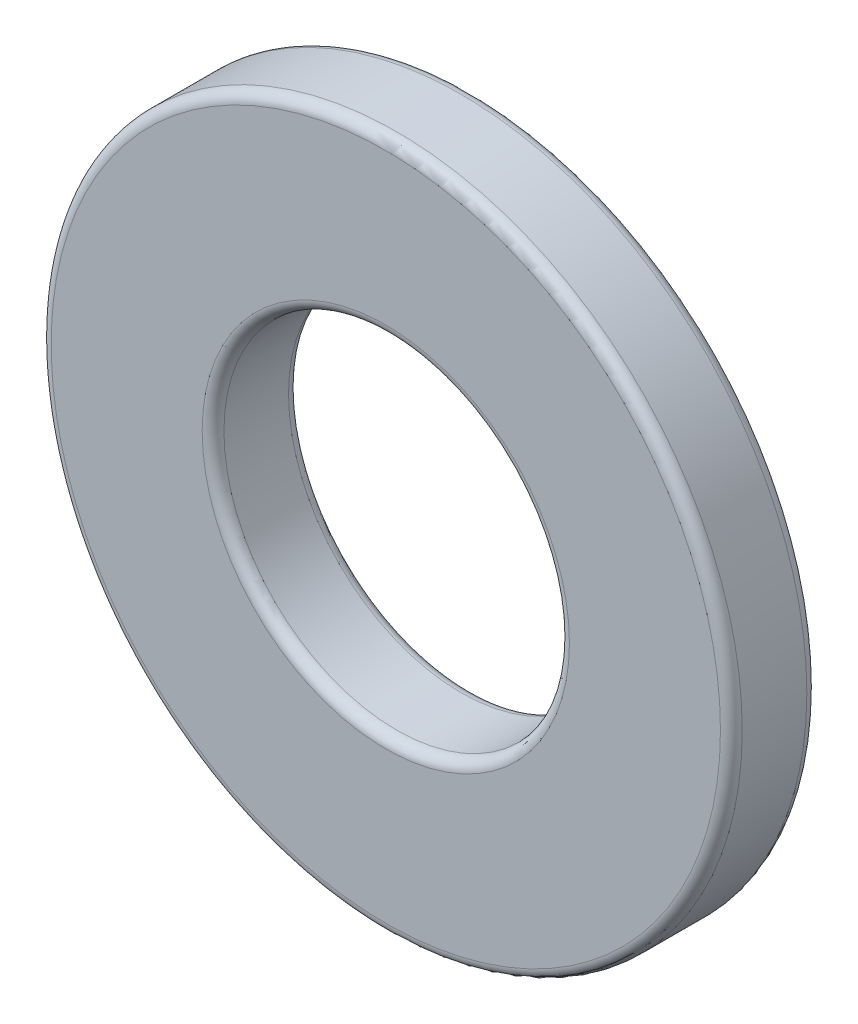
ISO-10303-21;
HEADER;
FILE_DESCRIPTION(('STEP AP214'),'2;1');
FILE_NAME('part.step','',(''),(''),'','','');
FILE_SCHEMA(('AUTOMOTIVE_DESIGN { 1 0 10303 214 1 1 1 1 }'));
ENDSEC;
DATA;
#1=APPLICATION_CONTEXT('core data for automotive mechanical design processes');
#2=APPLICATION_PROTOCOL_DEFINITION('international standard','automotive_design',2000,#1);
#3=PRODUCT_CONTEXT('',#1,'mechanical');
#4=PRODUCT('Part','Part','',(#3));
#5=PRODUCT_RELATED_PRODUCT_CATEGORY('part','',(#4));
#6=PRODUCT_DEFINITION_FORMATION('','',#4);
#7=PRODUCT_DEFINITION_CONTEXT('part definition',#1,'design');
#8=PRODUCT_DEFINITION('design','',#6,#7);
#9=PRODUCT_DEFINITION_SHAPE('','',#8);
#10=(LENGTH_UNIT() NAMED_UNIT(*) SI_UNIT(.MILLI.,.METRE.));
#11=(NAMED_UNIT(*) PLANE_ANGLE_UNIT() SI_UNIT($,.RADIAN.));
#12=(NAMED_UNIT(*) SI_UNIT($,.STERADIAN.) SOLID_ANGLE_UNIT());
#13=UNCERTAINTY_MEASURE_WITH_UNIT(LENGTH_MEASURE(1.E-05),#10,'distance_accuracy_value','');
#14=(GEOMETRIC_REPRESENTATION_CONTEXT(3) GLOBAL_UNCERTAINTY_ASSIGNED_CONTEXT((#13)) GLOBAL_UNIT_ASSIGNED_CONTEXT((#10,
#11,#12)) REPRESENTATION_CONTEXT('',''));
#15=CARTESIAN_POINT('',(0.,0.,0.));
#16=DIRECTION('',(0.,0.,1.));
#17=DIRECTION('',(1.,0.,0.));
#18=AXIS2_PLACEMENT_3D('',#15,#16,#17);
#19=CARTESIAN_POINT('',(68.3982464909084,3.21438697688714,1.5875));
#20=DIRECTION('',(0.,0.,-1.));
#21=DIRECTION('',(-1.,0.,0.));
#22=AXIS2_PLACEMENT_3D('',#19,#20,#21);
#23=CYLINDRICAL_SURFACE('',#22,6.35);
#24=CARTESIAN_POINT('',(68.3982464909084,3.21438697688714,0.2));
#25=DIRECTION('',(0.,0.,1.));
#26=DIRECTION('',(1.,0.,0.));
#27=AXIS2_PLACEMENT_3D('',#24,#25,#26);
#28=CIRCLE('',#27,6.35);
#29=CARTESIAN_POINT('',(74.7482464909084,3.21438697688714,0.2));
#30=VERTEX_POINT('',#29);
#31=EDGE_CURVE('E57',#30,#30,#28,.T.);
#32=ORIENTED_EDGE('',*,*,#31,.T.);
#33=EDGE_LOOP('',(#32));
#34=FACE_BOUND('',#33,.T.);
#35=CARTESIAN_POINT('',(68.3982464909084,3.21438697688714,1.3875));
#36=DIRECTION('',(0.,0.,1.));
#37=DIRECTION('',(1.,0.,0.));
#38=AXIS2_PLACEMENT_3D('',#35,#36,#37);
#39=CIRCLE('',#38,6.35);
#40=CARTESIAN_POINT('',(74.7482464909084,3.21438697688714,1.3875));
#41=VERTEX_POINT('',#40);
#42=EDGE_CURVE('E60',#41,#41,#39,.F.);
#43=ORIENTED_EDGE('',*,*,#42,.T.);
#44=EDGE_LOOP('',(#43));
#45=FACE_BOUND('',#44,.T.);
#46=ADVANCED_FACE('F31',(#34,#45),#23,.T.);
#47=CARTESIAN_POINT('',(68.3982464909084,3.21438697688714,1.5875));
#48=DIRECTION('',(0.,0.,1.));
#49=DIRECTION('',(1.,0.,0.));
#50=AXIS2_PLACEMENT_3D('',#47,#48,#49);
#51=PLANE('',#50);
#52=CARTESIAN_POINT('',(68.3982464909084,3.21438697688714,1.5875));
#53=DIRECTION('',(0.,0.,1.));
#54=DIRECTION('',(1.,0.,0.));
#55=AXIS2_PLACEMENT_3D('',#52,#53,#54);
#56=CIRCLE('',#55,6.15);
#57=CARTESIAN_POINT('',(74.5482464909084,3.21438697688714,1.5875));
#58=VERTEX_POINT('',#57);
#59=EDGE_CURVE('E10',#58,#58,#56,.T.);
#60=ORIENTED_EDGE('',*,*,#59,.T.);
#61=EDGE_LOOP('',(#60));
#62=FACE_BOUND('',#61,.T.);
#63=CARTESIAN_POINT('',(68.3982464909084,3.21438697688714,1.5875));
#64=DIRECTION('',(0.,0.,1.));
#65=DIRECTION('',(1.,0.,0.));
#66=AXIS2_PLACEMENT_3D('',#63,#64,#65);
#67=CIRCLE('',#66,3.375);
#68=CARTESIAN_POINT('',(71.7732464909084,3.21438697688714,1.5875));
#69=VERTEX_POINT('',#68);
#70=EDGE_CURVE('E38',#69,#69,#67,.F.);
#71=ORIENTED_EDGE('',*,*,#70,.T.);
#72=EDGE_LOOP('',(#71));
#73=FACE_BOUND('',#72,.T.);
#74=ADVANCED_FACE('F78',(#62,#73),#51,.T.);
#75=CARTESIAN_POINT('',(68.3982464909084,3.21438697688714,0.));
#76=DIRECTION('',(0.,0.,1.));
#77=DIRECTION('',(1.,0.,0.));
#78=AXIS2_PLACEMENT_3D('',#75,#76,#77);
#79=PLANE('',#78);
#80=CARTESIAN_POINT('',(68.3982464909084,3.21438697688714,0.));
#81=DIRECTION('',(0.,0.,1.));
#82=DIRECTION('',(1.,0.,0.));
#83=AXIS2_PLACEMENT_3D('',#80,#81,#82);
#84=CIRCLE('',#83,6.15);
#85=CARTESIAN_POINT('',(74.5482464909084,3.21438697688714,0.));
#86=VERTEX_POINT('',#85);
#87=EDGE_CURVE('E51',#86,#86,#84,.F.);
#88=ORIENTED_EDGE('',*,*,#87,.T.);
#89=EDGE_LOOP('',(#88));
#90=FACE_BOUND('',#89,.T.);
#91=CARTESIAN_POINT('',(68.3982464909084,3.21438697688714,0.));
#92=DIRECTION('',(0.,0.,1.));
#93=DIRECTION('',(1.,0.,0.));
#94=AXIS2_PLACEMENT_3D('',#91,#92,#93);
#95=CIRCLE('',#94,3.375);
#96=CARTESIAN_POINT('',(71.7732464909084,3.21438697688714,0.));
#97=VERTEX_POINT('',#96);
#98=EDGE_CURVE('E54',#97,#97,#95,.T.);
#99=ORIENTED_EDGE('',*,*,#98,.T.);
#100=EDGE_LOOP('',(#99));
#101=FACE_BOUND('',#100,.T.);
#102=ADVANCED_FACE('F84',(#90,#101),#79,.F.);
#103=CARTESIAN_POINT('',(68.3982464909084,3.21438697688714,1.5875));
#104=DIRECTION('',(0.,0.,-1.));
#105=DIRECTION('',(-1.,0.,0.));
#106=AXIS2_PLACEMENT_3D('',#103,#104,#105);
#107=CYLINDRICAL_SURFACE('',#106,3.175);
#108=CARTESIAN_POINT('',(68.3982464909084,3.21438697688714,0.2));
#109=DIRECTION('',(0.,0.,1.));
#110=DIRECTION('',(1.,0.,0.));
#111=AXIS2_PLACEMENT_3D('',#108,#109,#110);
#112=CIRCLE('',#111,3.175);
#113=CARTESIAN_POINT('',(71.5732464909084,3.21438697688714,0.2));
#114=VERTEX_POINT('',#113);
#115=EDGE_CURVE('E42',#114,#114,#112,.F.);
#116=ORIENTED_EDGE('',*,*,#115,.T.);
#117=EDGE_LOOP('',(#116));
#118=FACE_BOUND('',#117,.T.);
#119=CARTESIAN_POINT('',(68.3982464909084,3.21438697688714,1.3875));
#120=DIRECTION('',(0.,0.,1.));
#121=DIRECTION('',(1.,0.,0.));
#122=AXIS2_PLACEMENT_3D('',#119,#120,#121);
#123=CIRCLE('',#122,3.175);
#124=CARTESIAN_POINT('',(71.5732464909084,3.21438697688714,1.3875));
#125=VERTEX_POINT('',#124);
#126=EDGE_CURVE('E46',#125,#125,#123,.T.);
#127=ORIENTED_EDGE('',*,*,#126,.T.);
#128=EDGE_LOOP('',(#127));
#129=FACE_BOUND('',#128,.T.);
#130=ADVANCED_FACE('F89',(#118,#129),#107,.F.);
#131=CARTESIAN_POINT('',(68.3982464909084,3.21438697688714,0.2));
#132=DIRECTION('',(0.,0.,1.));
#133=DIRECTION('',(1.,0.,0.));
#134=AXIS2_PLACEMENT_3D('',#131,#132,#133);
#135=TOROIDAL_SURFACE('',#134,6.15,0.2);
#136=ORIENTED_EDGE('',*,*,#87,.F.);
#137=EDGE_LOOP('',(#136));
#138=FACE_BOUND('',#137,.T.);
#139=ORIENTED_EDGE('',*,*,#31,.F.);
#140=EDGE_LOOP('',(#139));
#141=FACE_BOUND('',#140,.T.);
#142=ADVANCED_FACE('F74',(#138,#141),#135,.T.);
#143=CARTESIAN_POINT('',(68.3982464909084,3.21438697688714,0.2));
#144=DIRECTION('',(0.,0.,1.));
#145=DIRECTION('',(1.,0.,0.));
#146=AXIS2_PLACEMENT_3D('',#143,#144,#145);
#147=TOROIDAL_SURFACE('',#146,3.375,0.2);
#148=ORIENTED_EDGE('',*,*,#98,.F.);
#149=EDGE_LOOP('',(#148));
#150=FACE_BOUND('',#149,.T.);
#151=ORIENTED_EDGE('',*,*,#115,.F.);
#152=EDGE_LOOP('',(#151));
#153=FACE_BOUND('',#152,.T.);
#154=ADVANCED_FACE('F68',(#150,#153),#147,.T.);
#155=CARTESIAN_POINT('',(68.3982464909084,3.21438697688714,1.3875));
#156=DIRECTION('',(0.,0.,1.));
#157=DIRECTION('',(1.,0.,0.));
#158=AXIS2_PLACEMENT_3D('',#155,#156,#157);
#159=TOROIDAL_SURFACE('',#158,6.15,0.2);
#160=ORIENTED_EDGE('',*,*,#42,.F.);
#161=EDGE_LOOP('',(#160));
#162=FACE_BOUND('',#161,.T.);
#163=ORIENTED_EDGE('',*,*,#59,.F.);
#164=EDGE_LOOP('',(#163));
#165=FACE_BOUND('',#164,.T.);
#166=ADVANCED_FACE('F65',(#162,#165),#159,.T.);
#167=CARTESIAN_POINT('',(68.3982464909084,3.21438697688714,1.3875));
#168=DIRECTION('',(0.,0.,1.));
#169=DIRECTION('',(1.,0.,0.));
#170=AXIS2_PLACEMENT_3D('',#167,#168,#169);
#171=TOROIDAL_SURFACE('',#170,3.375,0.2);
#172=ORIENTED_EDGE('',*,*,#126,.F.);
#173=EDGE_LOOP('',(#172));
#174=FACE_BOUND('',#173,.T.);
#175=ORIENTED_EDGE('',*,*,#70,.F.);
#176=EDGE_LOOP('',(#175));
#177=FACE_BOUND('',#176,.T.);
#178=ADVANCED_FACE('F33',(#174,#177),#171,.T.);
#179=CLOSED_SHELL('',(#46,#74,#102,#130,#142,#154,#166,#178));
#180=MANIFOLD_SOLID_BREP('B2',#179);
#181=ADVANCED_BREP_SHAPE_REPRESENTATION('',(#18,#180),#14);
#182=SHAPE_DEFINITION_REPRESENTATION(#9,#181);
ENDSEC;
END-ISO-10303-21;
